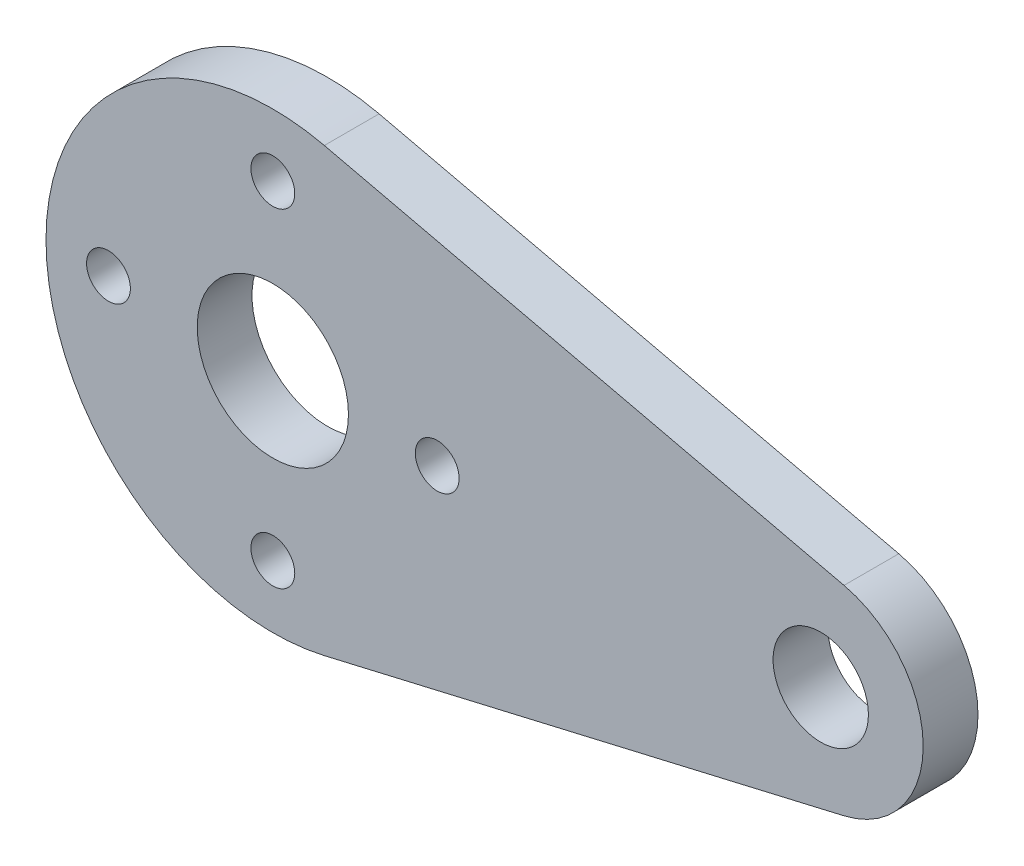
ISO-10303-21;
HEADER;
FILE_DESCRIPTION(('STEP AP214'),'2;1');
FILE_NAME('part.step','',(''),(''),'','','');
FILE_SCHEMA(('AUTOMOTIVE_DESIGN { 1 0 10303 214 1 1 1 1 }'));
ENDSEC;
DATA;
#1=APPLICATION_CONTEXT('core data for automotive mechanical design processes');
#2=APPLICATION_PROTOCOL_DEFINITION('international standard','automotive_design',2000,#1);
#3=PRODUCT_CONTEXT('',#1,'mechanical');
#4=PRODUCT('Part','Part','',(#3));
#5=PRODUCT_RELATED_PRODUCT_CATEGORY('part','',(#4));
#6=PRODUCT_DEFINITION_FORMATION('','',#4);
#7=PRODUCT_DEFINITION_CONTEXT('part definition',#1,'design');
#8=PRODUCT_DEFINITION('design','',#6,#7);
#9=PRODUCT_DEFINITION_SHAPE('','',#8);
#10=(LENGTH_UNIT() NAMED_UNIT(*) SI_UNIT(.MILLI.,.METRE.));
#11=(NAMED_UNIT(*) PLANE_ANGLE_UNIT() SI_UNIT($,.RADIAN.));
#12=(NAMED_UNIT(*) SI_UNIT($,.STERADIAN.) SOLID_ANGLE_UNIT());
#13=UNCERTAINTY_MEASURE_WITH_UNIT(LENGTH_MEASURE(1.E-05),#10,'distance_accuracy_value','');
#14=(GEOMETRIC_REPRESENTATION_CONTEXT(3) GLOBAL_UNCERTAINTY_ASSIGNED_CONTEXT((#13)) GLOBAL_UNIT_ASSIGNED_CONTEXT((#10,
#11,#12)) REPRESENTATION_CONTEXT('',''));
#15=CARTESIAN_POINT('',(0.,0.,0.));
#16=DIRECTION('',(0.,0.,1.));
#17=DIRECTION('',(1.,0.,0.));
#18=AXIS2_PLACEMENT_3D('',#15,#16,#17);
#19=CARTESIAN_POINT('',(0.,0.,5.));
#20=DIRECTION('',(0.,0.,1.));
#21=DIRECTION('',(1.,0.,0.));
#22=AXIS2_PLACEMENT_3D('',#19,#20,#21);
#23=PLANE('',#22);
#24=CARTESIAN_POINT('',(-15.,1.04744440165294E-13,5.));
#25=DIRECTION('',(0.,0.,1.));
#26=DIRECTION('',(1.,0.,0.));
#27=AXIS2_PLACEMENT_3D('',#24,#25,#26);
#28=CIRCLE('',#27,2.);
#29=CARTESIAN_POINT('',(-13.,1.04744440165294E-13,5.));
#30=VERTEX_POINT('',#29);
#31=EDGE_CURVE('E138',#30,#30,#28,.T.);
#32=ORIENTED_EDGE('',*,*,#31,.F.);
#33=EDGE_LOOP('',(#32));
#34=FACE_BOUND('',#33,.T.);
#35=CARTESIAN_POINT('',(15.,0.,5.));
#36=DIRECTION('',(0.,0.,1.));
#37=DIRECTION('',(1.,0.,0.));
#38=AXIS2_PLACEMENT_3D('',#35,#36,#37);
#39=CIRCLE('',#38,2.);
#40=CARTESIAN_POINT('',(17.,0.,5.));
#41=VERTEX_POINT('',#40);
#42=EDGE_CURVE('E126',#41,#41,#39,.T.);
#43=ORIENTED_EDGE('',*,*,#42,.F.);
#44=EDGE_LOOP('',(#43));
#45=FACE_BOUND('',#44,.T.);
#46=CARTESIAN_POINT('',(0.,0.,5.));
#47=DIRECTION('',(0.,0.,1.));
#48=DIRECTION('',(1.,0.,0.));
#49=AXIS2_PLACEMENT_3D('',#46,#47,#48);
#50=CIRCLE('',#49,6.9);
#51=CARTESIAN_POINT('',(6.9,0.,5.));
#52=VERTEX_POINT('',#51);
#53=EDGE_CURVE('E105',#52,#52,#50,.T.);
#54=ORIENTED_EDGE('',*,*,#53,.F.);
#55=EDGE_LOOP('',(#54));
#56=FACE_BOUND('',#55,.T.);
#57=CARTESIAN_POINT('',(0.,0.,5.));
#58=DIRECTION('',(0.,0.,1.));
#59=DIRECTION('',(1.,0.,0.));
#60=AXIS2_PLACEMENT_3D('',#57,#58,#59);
#61=CIRCLE('',#60,20.7);
#62=CARTESIAN_POINT('',(4.6989,20.1596214942146,5.));
#63=VERTEX_POINT('',#62);
#64=CARTESIAN_POINT('',(4.6989,-20.1596214942146,5.));
#65=VERTEX_POINT('',#64);
#66=EDGE_CURVE('E90',#63,#65,#61,.T.);
#67=ORIENTED_EDGE('',*,*,#66,.T.);
#68=DIRECTION('',(0.973894758174619,0.227,0.));
#69=VECTOR('',#68,1.);
#70=CARTESIAN_POINT('',(4.6989,-20.1596214942146,5.));
#71=LINE('',#70,#69);
#72=CARTESIAN_POINT('',(52.12245,-9.10591598893268,5.));
#73=VERTEX_POINT('',#72);
#74=EDGE_CURVE('E85',#65,#73,#71,.T.);
#75=ORIENTED_EDGE('',*,*,#74,.T.);
#76=CARTESIAN_POINT('',(50.,0.,5.));
#77=DIRECTION('',(0.,0.,1.));
#78=DIRECTION('',(1.,0.,0.));
#79=AXIS2_PLACEMENT_3D('',#76,#77,#78);
#80=CIRCLE('',#79,9.34999999999999);
#81=CARTESIAN_POINT('',(52.12245,9.10591598893268,5.));
#82=VERTEX_POINT('',#81);
#83=EDGE_CURVE('E88',#73,#82,#80,.T.);
#84=ORIENTED_EDGE('',*,*,#83,.T.);
#85=DIRECTION('',(-0.973894758174619,0.227,0.));
#86=VECTOR('',#85,1.);
#87=CARTESIAN_POINT('',(4.6989,20.1596214942146,5.));
#88=LINE('',#87,#86);
#89=EDGE_CURVE('E55',#82,#63,#88,.T.);
#90=ORIENTED_EDGE('',*,*,#89,.T.);
#91=EDGE_LOOP('',(#67,#75,#84,#90));
#92=FACE_BOUND('',#91,.T.);
#93=CARTESIAN_POINT('',(50.,0.,5.));
#94=DIRECTION('',(0.,0.,1.));
#95=DIRECTION('',(1.,0.,0.));
#96=AXIS2_PLACEMENT_3D('',#93,#94,#95);
#97=CIRCLE('',#96,4.35);
#98=CARTESIAN_POINT('',(54.35,0.,5.));
#99=VERTEX_POINT('',#98);
#100=EDGE_CURVE('E120',#99,#99,#97,.T.);
#101=ORIENTED_EDGE('',*,*,#100,.F.);
#102=EDGE_LOOP('',(#101));
#103=FACE_BOUND('',#102,.T.);
#104=CARTESIAN_POINT('',(0.,-15.,5.));
#105=DIRECTION('',(0.,0.,1.));
#106=DIRECTION('',(1.,0.,0.));
#107=AXIS2_PLACEMENT_3D('',#104,#105,#106);
#108=CIRCLE('',#107,2.);
#109=CARTESIAN_POINT('',(1.99999999999995,-15.,5.));
#110=VERTEX_POINT('',#109);
#111=EDGE_CURVE('E132',#110,#110,#108,.T.);
#112=ORIENTED_EDGE('',*,*,#111,.F.);
#113=EDGE_LOOP('',(#112));
#114=FACE_BOUND('',#113,.T.);
#115=CARTESIAN_POINT('',(1.57116660247941E-13,15.,5.));
#116=DIRECTION('',(0.,0.,1.));
#117=DIRECTION('',(1.,0.,0.));
#118=AXIS2_PLACEMENT_3D('',#115,#116,#117);
#119=CIRCLE('',#118,2.);
#120=CARTESIAN_POINT('',(2.00000000000016,15.,5.));
#121=VERTEX_POINT('',#120);
#122=EDGE_CURVE('E144',#121,#121,#119,.T.);
#123=ORIENTED_EDGE('',*,*,#122,.F.);
#124=EDGE_LOOP('',(#123));
#125=FACE_BOUND('',#124,.T.);
#126=ADVANCED_FACE('F38',(#34,#45,#56,#92,#103,#114,#125),#23,.T.);
#127=CARTESIAN_POINT('',(0.,0.,0.));
#128=DIRECTION('',(0.,0.,1.));
#129=DIRECTION('',(1.,0.,0.));
#130=AXIS2_PLACEMENT_3D('',#127,#128,#129);
#131=PLANE('',#130);
#132=CARTESIAN_POINT('',(0.,0.,0.));
#133=DIRECTION('',(0.,0.,1.));
#134=DIRECTION('',(1.,0.,0.));
#135=AXIS2_PLACEMENT_3D('',#132,#133,#134);
#136=CIRCLE('',#135,20.7);
#137=CARTESIAN_POINT('',(4.6989,20.1596214942146,0.));
#138=VERTEX_POINT('',#137);
#139=CARTESIAN_POINT('',(4.6989,-20.1596214942146,0.));
#140=VERTEX_POINT('',#139);
#141=EDGE_CURVE('E102',#138,#140,#136,.T.);
#142=ORIENTED_EDGE('',*,*,#141,.F.);
#143=DIRECTION('',(-0.973894758174619,0.227,0.));
#144=VECTOR('',#143,1.);
#145=CARTESIAN_POINT('',(4.6989,20.1596214942146,0.));
#146=LINE('',#145,#144);
#147=CARTESIAN_POINT('',(52.12245,9.10591598893268,0.));
#148=VERTEX_POINT('',#147);
#149=EDGE_CURVE('E78',#148,#138,#146,.T.);
#150=ORIENTED_EDGE('',*,*,#149,.F.);
#151=CARTESIAN_POINT('',(50.,0.,0.));
#152=DIRECTION('',(0.,0.,1.));
#153=DIRECTION('',(1.,0.,0.));
#154=AXIS2_PLACEMENT_3D('',#151,#152,#153);
#155=CIRCLE('',#154,9.34999999999999);
#156=CARTESIAN_POINT('',(52.12245,-9.10591598893268,0.));
#157=VERTEX_POINT('',#156);
#158=EDGE_CURVE('E72',#157,#148,#155,.T.);
#159=ORIENTED_EDGE('',*,*,#158,.F.);
#160=DIRECTION('',(0.973894758174619,0.227,0.));
#161=VECTOR('',#160,1.);
#162=CARTESIAN_POINT('',(4.6989,-20.1596214942146,0.));
#163=LINE('',#162,#161);
#164=EDGE_CURVE('E94',#140,#157,#163,.T.);
#165=ORIENTED_EDGE('',*,*,#164,.F.);
#166=EDGE_LOOP('',(#142,#150,#159,#165));
#167=FACE_BOUND('',#166,.T.);
#168=CARTESIAN_POINT('',(0.,0.,0.));
#169=DIRECTION('',(0.,0.,1.));
#170=DIRECTION('',(1.,0.,0.));
#171=AXIS2_PLACEMENT_3D('',#168,#169,#170);
#172=CIRCLE('',#171,6.9);
#173=CARTESIAN_POINT('',(6.9,0.,0.));
#174=VERTEX_POINT('',#173);
#175=EDGE_CURVE('E117',#174,#174,#172,.T.);
#176=ORIENTED_EDGE('',*,*,#175,.T.);
#177=EDGE_LOOP('',(#176));
#178=FACE_BOUND('',#177,.T.);
#179=CARTESIAN_POINT('',(50.,0.,0.));
#180=DIRECTION('',(0.,0.,1.));
#181=DIRECTION('',(1.,0.,0.));
#182=AXIS2_PLACEMENT_3D('',#179,#180,#181);
#183=CIRCLE('',#182,4.35);
#184=CARTESIAN_POINT('',(54.35,0.,0.));
#185=VERTEX_POINT('',#184);
#186=EDGE_CURVE('E123',#185,#185,#183,.T.);
#187=ORIENTED_EDGE('',*,*,#186,.T.);
#188=EDGE_LOOP('',(#187));
#189=FACE_BOUND('',#188,.T.);
#190=CARTESIAN_POINT('',(15.,0.,0.));
#191=DIRECTION('',(0.,0.,1.));
#192=DIRECTION('',(1.,0.,0.));
#193=AXIS2_PLACEMENT_3D('',#190,#191,#192);
#194=CIRCLE('',#193,2.);
#195=CARTESIAN_POINT('',(17.,0.,0.));
#196=VERTEX_POINT('',#195);
#197=EDGE_CURVE('E129',#196,#196,#194,.T.);
#198=ORIENTED_EDGE('',*,*,#197,.T.);
#199=EDGE_LOOP('',(#198));
#200=FACE_BOUND('',#199,.T.);
#201=CARTESIAN_POINT('',(0.,-15.,0.));
#202=DIRECTION('',(0.,0.,1.));
#203=DIRECTION('',(1.,0.,0.));
#204=AXIS2_PLACEMENT_3D('',#201,#202,#203);
#205=CIRCLE('',#204,2.);
#206=CARTESIAN_POINT('',(1.99999999999995,-15.,0.));
#207=VERTEX_POINT('',#206);
#208=EDGE_CURVE('E135',#207,#207,#205,.T.);
#209=ORIENTED_EDGE('',*,*,#208,.T.);
#210=EDGE_LOOP('',(#209));
#211=FACE_BOUND('',#210,.T.);
#212=CARTESIAN_POINT('',(-15.,1.04744440165294E-13,0.));
#213=DIRECTION('',(0.,0.,1.));
#214=DIRECTION('',(1.,0.,0.));
#215=AXIS2_PLACEMENT_3D('',#212,#213,#214);
#216=CIRCLE('',#215,2.);
#217=CARTESIAN_POINT('',(-13.,1.04744440165294E-13,0.));
#218=VERTEX_POINT('',#217);
#219=EDGE_CURVE('E141',#218,#218,#216,.T.);
#220=ORIENTED_EDGE('',*,*,#219,.T.);
#221=EDGE_LOOP('',(#220));
#222=FACE_BOUND('',#221,.T.);
#223=CARTESIAN_POINT('',(1.57116660247941E-13,15.,0.));
#224=DIRECTION('',(0.,0.,1.));
#225=DIRECTION('',(1.,0.,0.));
#226=AXIS2_PLACEMENT_3D('',#223,#224,#225);
#227=CIRCLE('',#226,2.);
#228=CARTESIAN_POINT('',(2.00000000000016,15.,0.));
#229=VERTEX_POINT('',#228);
#230=EDGE_CURVE('E147',#229,#229,#227,.T.);
#231=ORIENTED_EDGE('',*,*,#230,.T.);
#232=EDGE_LOOP('',(#231));
#233=FACE_BOUND('',#232,.T.);
#234=ADVANCED_FACE('F113',(#167,#178,#189,#200,#211,#222,#233),#131,.F.);
#235=CARTESIAN_POINT('',(0.,0.,5.));
#236=DIRECTION('',(0.,0.,-1.));
#237=DIRECTION('',(-1.,0.,0.));
#238=AXIS2_PLACEMENT_3D('',#235,#236,#237);
#239=CYLINDRICAL_SURFACE('',#238,20.7);
#240=ORIENTED_EDGE('',*,*,#141,.T.);
#241=DIRECTION('',(0.,0.,-1.));
#242=VECTOR('',#241,1.);
#243=CARTESIAN_POINT('',(4.6989,-20.1596214942146,5.));
#244=LINE('',#243,#242);
#245=EDGE_CURVE('E11',#65,#140,#244,.T.);
#246=ORIENTED_EDGE('',*,*,#245,.F.);
#247=ORIENTED_EDGE('',*,*,#66,.F.);
#248=DIRECTION('',(0.,0.,-1.));
#249=VECTOR('',#248,1.);
#250=CARTESIAN_POINT('',(4.6989,20.1596214942146,5.));
#251=LINE('',#250,#249);
#252=EDGE_CURVE('E98',#63,#138,#251,.T.);
#253=ORIENTED_EDGE('',*,*,#252,.T.);
#254=EDGE_LOOP('',(#240,#246,#247,#253));
#255=FACE_BOUND('',#254,.T.);
#256=ADVANCED_FACE('F40',(#255),#239,.T.);
#257=CARTESIAN_POINT('',(4.6989,-20.1596214942146,5.));
#258=DIRECTION('',(-0.227,0.973894758174619,0.));
#259=DIRECTION('',(-0.973894758174619,-0.227,0.));
#260=AXIS2_PLACEMENT_3D('',#257,#258,#259);
#261=PLANE('',#260);
#262=ORIENTED_EDGE('',*,*,#164,.T.);
#263=DIRECTION('',(0.,0.,-1.));
#264=VECTOR('',#263,1.);
#265=CARTESIAN_POINT('',(52.12245,-9.10591598893268,5.));
#266=LINE('',#265,#264);
#267=EDGE_CURVE('E47',#73,#157,#266,.T.);
#268=ORIENTED_EDGE('',*,*,#267,.F.);
#269=ORIENTED_EDGE('',*,*,#74,.F.);
#270=ORIENTED_EDGE('',*,*,#245,.T.);
#271=EDGE_LOOP('',(#262,#268,#269,#270));
#272=FACE_BOUND('',#271,.T.);
#273=ADVANCED_FACE('F93',(#272),#261,.F.);
#274=CARTESIAN_POINT('',(50.,0.,5.));
#275=DIRECTION('',(0.,0.,-1.));
#276=DIRECTION('',(-1.,0.,0.));
#277=AXIS2_PLACEMENT_3D('',#274,#275,#276);
#278=CYLINDRICAL_SURFACE('',#277,9.34999999999999);
#279=ORIENTED_EDGE('',*,*,#158,.T.);
#280=DIRECTION('',(0.,0.,-1.));
#281=VECTOR('',#280,1.);
#282=CARTESIAN_POINT('',(52.12245,9.10591598893268,5.));
#283=LINE('',#282,#281);
#284=EDGE_CURVE('E95',#82,#148,#283,.T.);
#285=ORIENTED_EDGE('',*,*,#284,.F.);
#286=ORIENTED_EDGE('',*,*,#83,.F.);
#287=ORIENTED_EDGE('',*,*,#267,.T.);
#288=EDGE_LOOP('',(#279,#285,#286,#287));
#289=FACE_BOUND('',#288,.T.);
#290=ADVANCED_FACE('F96',(#289),#278,.T.);
#291=CARTESIAN_POINT('',(4.6989,20.1596214942146,5.));
#292=DIRECTION('',(-0.227,-0.973894758174619,0.));
#293=DIRECTION('',(0.973894758174619,-0.227,0.));
#294=AXIS2_PLACEMENT_3D('',#291,#292,#293);
#295=PLANE('',#294);
#296=ORIENTED_EDGE('',*,*,#149,.T.);
#297=ORIENTED_EDGE('',*,*,#252,.F.);
#298=ORIENTED_EDGE('',*,*,#89,.F.);
#299=ORIENTED_EDGE('',*,*,#284,.T.);
#300=EDGE_LOOP('',(#296,#297,#298,#299));
#301=FACE_BOUND('',#300,.T.);
#302=ADVANCED_FACE('F110',(#301),#295,.F.);
#303=CARTESIAN_POINT('',(0.,0.,5.));
#304=DIRECTION('',(0.,0.,-1.));
#305=DIRECTION('',(-1.,0.,0.));
#306=AXIS2_PLACEMENT_3D('',#303,#304,#305);
#307=CYLINDRICAL_SURFACE('',#306,6.9);
#308=ORIENTED_EDGE('',*,*,#53,.T.);
#309=EDGE_LOOP('',(#308));
#310=FACE_BOUND('',#309,.T.);
#311=ORIENTED_EDGE('',*,*,#175,.F.);
#312=EDGE_LOOP('',(#311));
#313=FACE_BOUND('',#312,.T.);
#314=ADVANCED_FACE('F166',(#310,#313),#307,.F.);
#315=CARTESIAN_POINT('',(50.,0.,5.));
#316=DIRECTION('',(0.,0.,-1.));
#317=DIRECTION('',(-1.,0.,0.));
#318=AXIS2_PLACEMENT_3D('',#315,#316,#317);
#319=CYLINDRICAL_SURFACE('',#318,4.35);
#320=ORIENTED_EDGE('',*,*,#100,.T.);
#321=EDGE_LOOP('',(#320));
#322=FACE_BOUND('',#321,.T.);
#323=ORIENTED_EDGE('',*,*,#186,.F.);
#324=EDGE_LOOP('',(#323));
#325=FACE_BOUND('',#324,.T.);
#326=ADVANCED_FACE('F212',(#322,#325),#319,.F.);
#327=CARTESIAN_POINT('',(15.,0.,5.));
#328=DIRECTION('',(0.,0.,-1.));
#329=DIRECTION('',(-1.,0.,0.));
#330=AXIS2_PLACEMENT_3D('',#327,#328,#329);
#331=CYLINDRICAL_SURFACE('',#330,2.);
#332=ORIENTED_EDGE('',*,*,#42,.T.);
#333=EDGE_LOOP('',(#332));
#334=FACE_BOUND('',#333,.T.);
#335=ORIENTED_EDGE('',*,*,#197,.F.);
#336=EDGE_LOOP('',(#335));
#337=FACE_BOUND('',#336,.T.);
#338=ADVANCED_FACE('F220',(#334,#337),#331,.F.);
#339=CARTESIAN_POINT('',(0.,-15.,5.));
#340=DIRECTION('',(0.,0.,-1.));
#341=DIRECTION('',(-1.,0.,0.));
#342=AXIS2_PLACEMENT_3D('',#339,#340,#341);
#343=CYLINDRICAL_SURFACE('',#342,2.);
#344=ORIENTED_EDGE('',*,*,#111,.T.);
#345=EDGE_LOOP('',(#344));
#346=FACE_BOUND('',#345,.T.);
#347=ORIENTED_EDGE('',*,*,#208,.F.);
#348=EDGE_LOOP('',(#347));
#349=FACE_BOUND('',#348,.T.);
#350=ADVANCED_FACE('F228',(#346,#349),#343,.F.);
#351=CARTESIAN_POINT('',(-15.,1.04744440165294E-13,5.));
#352=DIRECTION('',(0.,0.,-1.));
#353=DIRECTION('',(-1.,0.,0.));
#354=AXIS2_PLACEMENT_3D('',#351,#352,#353);
#355=CYLINDRICAL_SURFACE('',#354,2.);
#356=ORIENTED_EDGE('',*,*,#31,.T.);
#357=EDGE_LOOP('',(#356));
#358=FACE_BOUND('',#357,.T.);
#359=ORIENTED_EDGE('',*,*,#219,.F.);
#360=EDGE_LOOP('',(#359));
#361=FACE_BOUND('',#360,.T.);
#362=ADVANCED_FACE('F237',(#358,#361),#355,.F.);
#363=CARTESIAN_POINT('',(1.57116660247941E-13,15.,5.));
#364=DIRECTION('',(0.,0.,-1.));
#365=DIRECTION('',(-1.,0.,0.));
#366=AXIS2_PLACEMENT_3D('',#363,#364,#365);
#367=CYLINDRICAL_SURFACE('',#366,2.);
#368=ORIENTED_EDGE('',*,*,#122,.T.);
#369=EDGE_LOOP('',(#368));
#370=FACE_BOUND('',#369,.T.);
#371=ORIENTED_EDGE('',*,*,#230,.F.);
#372=EDGE_LOOP('',(#371));
#373=FACE_BOUND('',#372,.T.);
#374=ADVANCED_FACE('F153',(#370,#373),#367,.F.);
#375=CLOSED_SHELL('',(#126,#234,#256,#273,#290,#302,#314,#326,#338,#350,#362,#374));
#376=MANIFOLD_SOLID_BREP('B2',#375);
#377=ADVANCED_BREP_SHAPE_REPRESENTATION('',(#18,#376),#14);
#378=SHAPE_DEFINITION_REPRESENTATION(#9,#377);
ENDSEC;
END-ISO-10303-21;
